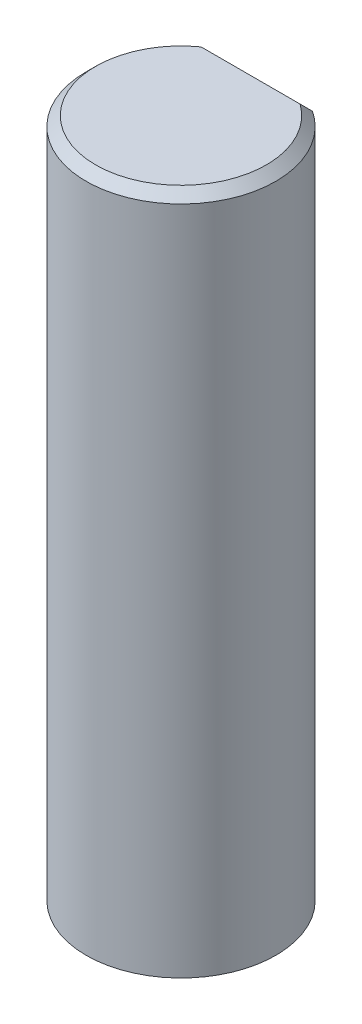
ISO-10303-21;
HEADER;
FILE_DESCRIPTION(('STEP AP214'),'2;1');
FILE_NAME('part.step','',(''),(''),'','','');
FILE_SCHEMA(('AUTOMOTIVE_DESIGN { 1 0 10303 214 1 1 1 1 }'));
ENDSEC;
DATA;
#1=APPLICATION_CONTEXT('core data for automotive mechanical design processes');
#2=APPLICATION_PROTOCOL_DEFINITION('international standard','automotive_design',2000,#1);
#3=PRODUCT_CONTEXT('',#1,'mechanical');
#4=PRODUCT('Part','Part','',(#3));
#5=PRODUCT_RELATED_PRODUCT_CATEGORY('part','',(#4));
#6=PRODUCT_DEFINITION_FORMATION('','',#4);
#7=PRODUCT_DEFINITION_CONTEXT('part definition',#1,'design');
#8=PRODUCT_DEFINITION('design','',#6,#7);
#9=PRODUCT_DEFINITION_SHAPE('','',#8);
#10=(LENGTH_UNIT() NAMED_UNIT(*) SI_UNIT(.MILLI.,.METRE.));
#11=(NAMED_UNIT(*) PLANE_ANGLE_UNIT() SI_UNIT($,.RADIAN.));
#12=(NAMED_UNIT(*) SI_UNIT($,.STERADIAN.) SOLID_ANGLE_UNIT());
#13=UNCERTAINTY_MEASURE_WITH_UNIT(LENGTH_MEASURE(1.E-05),#10,'distance_accuracy_value','');
#14=(GEOMETRIC_REPRESENTATION_CONTEXT(3) GLOBAL_UNCERTAINTY_ASSIGNED_CONTEXT((#13)) GLOBAL_UNIT_ASSIGNED_CONTEXT((#10,
#11,#12)) REPRESENTATION_CONTEXT('',''));
#15=CARTESIAN_POINT('',(0.,0.,0.));
#16=DIRECTION('',(0.,0.,1.));
#17=DIRECTION('',(1.,0.,0.));
#18=AXIS2_PLACEMENT_3D('',#15,#16,#17);
#19=CARTESIAN_POINT('',(0.,21.5,0.));
#20=DIRECTION('',(0.,-1.,0.));
#21=DIRECTION('',(0.,0.,-1.));
#22=AXIS2_PLACEMENT_3D('',#19,#20,#21);
#23=CYLINDRICAL_SURFACE('',#22,3.);
#24=DIRECTION('',(0.,1.,0.));
#25=VECTOR('',#24,1.);
#26=CARTESIAN_POINT('',(1.6583123951777,9.5,-2.5));
#27=LINE('',#26,#25);
#28=CARTESIAN_POINT('',(1.6583123951777,9.5,-2.5));
#29=VERTEX_POINT('',#28);
#30=CARTESIAN_POINT('',(1.6583123951777,21.2,-2.5));
#31=VERTEX_POINT('',#30);
#32=EDGE_CURVE('E96',#29,#31,#27,.T.);
#33=ORIENTED_EDGE('',*,*,#32,.T.);
#34=CARTESIAN_POINT('',(0.,21.2,0.));
#35=DIRECTION('',(0.,1.,0.));
#36=DIRECTION('',(0.,0.,1.));
#37=AXIS2_PLACEMENT_3D('',#34,#35,#36);
#38=CIRCLE('',#37,3.);
#39=CARTESIAN_POINT('',(-1.6583123951777,21.2,-2.5));
#40=VERTEX_POINT('',#39);
#41=EDGE_CURVE('E11',#31,#40,#38,.F.);
#42=ORIENTED_EDGE('',*,*,#41,.T.);
#43=DIRECTION('',(0.,1.,0.));
#44=VECTOR('',#43,1.);
#45=CARTESIAN_POINT('',(-1.6583123951777,9.5,-2.5));
#46=LINE('',#45,#44);
#47=CARTESIAN_POINT('',(-1.6583123951777,9.5,-2.5));
#48=VERTEX_POINT('',#47);
#49=EDGE_CURVE('E92',#48,#40,#46,.T.);
#50=ORIENTED_EDGE('',*,*,#49,.F.);
#51=CARTESIAN_POINT('',(0.,9.5,0.));
#52=DIRECTION('',(0.,1.,0.));
#53=DIRECTION('',(0.,0.,1.));
#54=AXIS2_PLACEMENT_3D('',#51,#52,#53);
#55=CIRCLE('',#54,3.);
#56=EDGE_CURVE('E84',#29,#48,#55,.T.);
#57=ORIENTED_EDGE('',*,*,#56,.F.);
#58=EDGE_LOOP('',(#33,#42,#50,#57));
#59=FACE_BOUND('',#58,.T.);
#60=CARTESIAN_POINT('',(0.,0.,0.));
#61=DIRECTION('',(0.,1.,0.));
#62=DIRECTION('',(0.,0.,1.));
#63=AXIS2_PLACEMENT_3D('',#60,#61,#62);
#64=CIRCLE('',#63,3.);
#65=CARTESIAN_POINT('',(0.,0.,3.));
#66=VERTEX_POINT('',#65);
#67=EDGE_CURVE('E101',#66,#66,#64,.T.);
#68=ORIENTED_EDGE('',*,*,#67,.T.);
#69=EDGE_LOOP('',(#68));
#70=FACE_BOUND('',#69,.T.);
#71=ADVANCED_FACE('F41',(#59,#70),#23,.T.);
#72=CARTESIAN_POINT('',(0.,21.5,0.));
#73=DIRECTION('',(0.,1.,0.));
#74=DIRECTION('',(0.,0.,1.));
#75=AXIS2_PLACEMENT_3D('',#72,#73,#74);
#76=PLANE('',#75);
#77=CARTESIAN_POINT('',(0.,21.5,0.));
#78=DIRECTION('',(0.,1.,0.));
#79=DIRECTION('',(0.,0.,1.));
#80=AXIS2_PLACEMENT_3D('',#77,#78,#79);
#81=CIRCLE('',#80,2.7);
#82=CARTESIAN_POINT('',(-1.56524758425015,21.5,-2.19999999999979));
#83=VERTEX_POINT('',#82);
#84=CARTESIAN_POINT('',(1.56524758425015,21.5,-2.19999999999979));
#85=VERTEX_POINT('',#84);
#86=EDGE_CURVE('E65',#83,#85,#81,.T.);
#87=ORIENTED_EDGE('',*,*,#86,.T.);
#88=DIRECTION('',(-1.,0.,0.));
#89=VECTOR('',#88,1.);
#90=CARTESIAN_POINT('',(-1.6583123951777,21.5,-2.2));
#91=LINE('',#90,#89);
#92=EDGE_CURVE('E57',#85,#83,#91,.T.);
#93=ORIENTED_EDGE('',*,*,#92,.T.);
#94=EDGE_LOOP('',(#87,#93));
#95=FACE_BOUND('',#94,.T.);
#96=ADVANCED_FACE('F121',(#95),#76,.T.);
#97=CARTESIAN_POINT('',(0.,0.,0.));
#98=DIRECTION('',(0.,1.,0.));
#99=DIRECTION('',(0.,0.,1.));
#100=AXIS2_PLACEMENT_3D('',#97,#98,#99);
#101=PLANE('',#100);
#102=ORIENTED_EDGE('',*,*,#67,.F.);
#103=EDGE_LOOP('',(#102));
#104=FACE_BOUND('',#103,.T.);
#105=ADVANCED_FACE('F127',(#104),#101,.F.);
#106=CARTESIAN_POINT('',(-1.6583123951777,9.5,-2.5));
#107=DIRECTION('',(0.,0.,1.));
#108=DIRECTION('',(1.,0.,0.));
#109=AXIS2_PLACEMENT_3D('',#106,#107,#108);
#110=PLANE('',#109);
#111=ORIENTED_EDGE('',*,*,#49,.T.);
#112=DIRECTION('',(1.,0.,0.));
#113=VECTOR('',#112,1.);
#114=CARTESIAN_POINT('',(1.6583123951777,21.2,-2.5));
#115=LINE('',#114,#113);
#116=EDGE_CURVE('E106',#40,#31,#115,.T.);
#117=ORIENTED_EDGE('',*,*,#116,.T.);
#118=ORIENTED_EDGE('',*,*,#32,.F.);
#119=DIRECTION('',(1.,0.,0.));
#120=VECTOR('',#119,1.);
#121=CARTESIAN_POINT('',(-1.6583123951777,9.5,-2.5));
#122=LINE('',#121,#120);
#123=EDGE_CURVE('E81',#48,#29,#122,.T.);
#124=ORIENTED_EDGE('',*,*,#123,.F.);
#125=EDGE_LOOP('',(#111,#117,#118,#124));
#126=FACE_BOUND('',#125,.T.);
#127=ADVANCED_FACE('F91',(#126),#110,.F.);
#128=CARTESIAN_POINT('',(0.,9.5,0.));
#129=DIRECTION('',(0.,1.,0.));
#130=DIRECTION('',(0.,0.,1.));
#131=AXIS2_PLACEMENT_3D('',#128,#129,#130);
#132=PLANE('',#131);
#133=ORIENTED_EDGE('',*,*,#56,.T.);
#134=ORIENTED_EDGE('',*,*,#123,.T.);
#135=EDGE_LOOP('',(#133,#134));
#136=FACE_BOUND('',#135,.T.);
#137=ADVANCED_FACE('F85',(#136),#132,.T.);
#138=CARTESIAN_POINT('',(0.,21.5,0.));
#139=DIRECTION('',(0.,-1.,0.));
#140=DIRECTION('',(0.,0.,-1.));
#141=AXIS2_PLACEMENT_3D('',#138,#139,#140);
#142=CONICAL_SURFACE('',#141,2.7,0.785398163397443);
#143=CARTESIAN_POINT('',(1.6583123951777,21.2,-2.5));
#144=CARTESIAN_POINT('',(1.64322876187384,21.2500662320887,-2.44993376791129));
#145=CARTESIAN_POINT('',(1.62793154813919,21.3000993361403,-2.39990066385971));
#146=CARTESIAN_POINT('',(1.59690994490715,21.400099336204,-2.29990066379605));
#147=CARTESIAN_POINT('',(1.58118555499939,21.4500662321524,-2.24993376784763));
#148=CARTESIAN_POINT('',(1.56524758425046,21.5,-2.19999999999997));
#149=B_SPLINE_CURVE_WITH_KNOTS('',3,(#143,#144,#145,#146,#147,#148),.UNSPECIFIED.,.F.,.F.,(4,2,
4),(0.,0.217176540517287,0.434353289674994),.UNSPECIFIED.);
#150=EDGE_CURVE('E108',#85,#31,#149,.F.);
#151=ORIENTED_EDGE('',*,*,#150,.F.);
#152=ORIENTED_EDGE('',*,*,#86,.F.);
#153=CARTESIAN_POINT('',(-1.56524758425029,21.5,-2.2));
#154=CARTESIAN_POINT('',(-1.58118555499919,21.4500662321523,-2.24993376784766));
#155=CARTESIAN_POINT('',(-1.596909944907,21.4000993362039,-2.29990066379607));
#156=CARTESIAN_POINT('',(-1.62793154813933,21.3000993361403,-2.39990066385968));
#157=CARTESIAN_POINT('',(-1.64322876187422,21.2500662320888,-2.44993376791123));
#158=CARTESIAN_POINT('',(-1.6583123951784,21.2000000000001,-2.49999999999989));
#159=B_SPLINE_CURVE_WITH_KNOTS('',3,(#153,#154,#155,#156,#157,#158),.UNSPECIFIED.,.F.,.F.,(4,2,
4),(0.,0.217176749157705,0.434353289674988),.UNSPECIFIED.);
#160=EDGE_CURVE('E50',#40,#83,#159,.F.);
#161=ORIENTED_EDGE('',*,*,#160,.F.);
#162=ORIENTED_EDGE('',*,*,#41,.F.);
#163=EDGE_LOOP('',(#151,#152,#161,#162));
#164=FACE_BOUND('',#163,.T.);
#165=ADVANCED_FACE('F113',(#164),#142,.T.);
#166=CARTESIAN_POINT('',(-1.6583123951777,21.2,-2.5));
#167=DIRECTION('',(0.,0.707106781186544,-0.707106781186551));
#168=DIRECTION('',(-1.,0.,0.));
#169=AXIS2_PLACEMENT_3D('',#166,#167,#168);
#170=PLANE('',#169);
#171=ORIENTED_EDGE('',*,*,#160,.T.);
#172=ORIENTED_EDGE('',*,*,#92,.F.);
#173=ORIENTED_EDGE('',*,*,#150,.T.);
#174=ORIENTED_EDGE('',*,*,#116,.F.);
#175=EDGE_LOOP('',(#171,#172,#173,#174));
#176=FACE_BOUND('',#175,.T.);
#177=ADVANCED_FACE('F42',(#176),#170,.T.);
#178=CLOSED_SHELL('',(#71,#96,#105,#127,#137,#165,#177));
#179=MANIFOLD_SOLID_BREP('B2',#178);
#180=ADVANCED_BREP_SHAPE_REPRESENTATION('',(#18,#179),#14);
#181=SHAPE_DEFINITION_REPRESENTATION(#9,#180);
ENDSEC;
END-ISO-10303-21;
